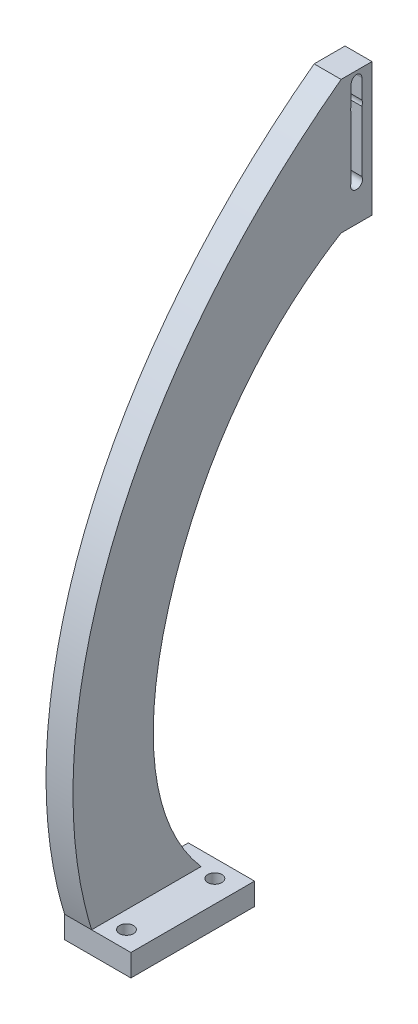
ISO-10303-21;
HEADER;
FILE_DESCRIPTION(('STEP AP214'),'2;1');
FILE_NAME('part.step','',(''),(''),'','','');
FILE_SCHEMA(('AUTOMOTIVE_DESIGN { 1 0 10303 214 1 1 1 1 }'));
ENDSEC;
DATA;
#1=APPLICATION_CONTEXT('core data for automotive mechanical design processes');
#2=APPLICATION_PROTOCOL_DEFINITION('international standard','automotive_design',2000,#1);
#3=PRODUCT_CONTEXT('',#1,'mechanical');
#4=PRODUCT('Part','Part','',(#3));
#5=PRODUCT_RELATED_PRODUCT_CATEGORY('part','',(#4));
#6=PRODUCT_DEFINITION_FORMATION('','',#4);
#7=PRODUCT_DEFINITION_CONTEXT('part definition',#1,'design');
#8=PRODUCT_DEFINITION('design','',#6,#7);
#9=PRODUCT_DEFINITION_SHAPE('','',#8);
#10=(LENGTH_UNIT() NAMED_UNIT(*) SI_UNIT(.MILLI.,.METRE.));
#11=(NAMED_UNIT(*) PLANE_ANGLE_UNIT() SI_UNIT($,.RADIAN.));
#12=(NAMED_UNIT(*) SI_UNIT($,.STERADIAN.) SOLID_ANGLE_UNIT());
#13=UNCERTAINTY_MEASURE_WITH_UNIT(LENGTH_MEASURE(1.E-05),#10,'distance_accuracy_value','');
#14=(GEOMETRIC_REPRESENTATION_CONTEXT(3) GLOBAL_UNCERTAINTY_ASSIGNED_CONTEXT((#13)) GLOBAL_UNIT_ASSIGNED_CONTEXT((#10,
#11,#12)) REPRESENTATION_CONTEXT('',''));
#15=CARTESIAN_POINT('',(0.,0.,0.));
#16=DIRECTION('',(0.,0.,1.));
#17=DIRECTION('',(1.,0.,0.));
#18=AXIS2_PLACEMENT_3D('',#15,#16,#17);
#19=CARTESIAN_POINT('',(42.,136.5,-45.9823957456189));
#20=DIRECTION('',(-1.,0.,0.));
#21=DIRECTION('',(0.,0.,-1.));
#22=AXIS2_PLACEMENT_3D('',#19,#20,#21);
#23=CYLINDRICAL_SURFACE('',#22,1.35);
#24=CARTESIAN_POINT('',(35.,136.5,-45.9823957456189));
#25=DIRECTION('',(1.,0.,0.));
#26=DIRECTION('',(0.,0.,-1.));
#27=AXIS2_PLACEMENT_3D('',#24,#25,#26);
#28=CIRCLE('',#27,1.35);
#29=CARTESIAN_POINT('',(35.,135.881534156157,-47.1823957456189));
#30=VERTEX_POINT('',#29);
#31=CARTESIAN_POINT('',(35.,137.118465843843,-47.1823957456189));
#32=VERTEX_POINT('',#31);
#33=EDGE_CURVE('E272',#30,#32,#28,.T.);
#34=ORIENTED_EDGE('',*,*,#33,.F.);
#35=DIRECTION('',(-1.,0.,0.));
#36=VECTOR('',#35,1.);
#37=CARTESIAN_POINT('',(42.,135.881534156157,-47.1823957456189));
#38=LINE('',#37,#36);
#39=CARTESIAN_POINT('',(41.0999999999906,135.881534156157,-47.1823957456189));
#40=VERTEX_POINT('',#39);
#41=EDGE_CURVE('E53',#30,#40,#38,.F.);
#42=ORIENTED_EDGE('',*,*,#41,.T.);
#43=CARTESIAN_POINT('',(41.0999999999905,136.5,-45.9823957456189));
#44=DIRECTION('',(-1.,0.,0.));
#45=DIRECTION('',(0.,-1.,0.));
#46=AXIS2_PLACEMENT_3D('',#43,#44,#45);
#47=CIRCLE('',#46,1.35);
#48=CARTESIAN_POINT('',(41.0999999999905,137.118465843843,-47.1823957456189));
#49=VERTEX_POINT('',#48);
#50=EDGE_CURVE('E285',#49,#40,#47,.T.);
#51=ORIENTED_EDGE('',*,*,#50,.F.);
#52=DIRECTION('',(-1.,0.,0.));
#53=VECTOR('',#52,1.);
#54=CARTESIAN_POINT('',(42.,137.118465843843,-47.1823957456189));
#55=LINE('',#54,#53);
#56=EDGE_CURVE('E575',#49,#32,#55,.T.);
#57=ORIENTED_EDGE('',*,*,#56,.T.);
#58=EDGE_LOOP('',(#34,#42,#51,#57));
#59=FACE_BOUND('',#58,.T.);
#60=ADVANCED_FACE('F44',(#59),#23,.F.);
#61=CARTESIAN_POINT('',(40.,5.,0.));
#62=DIRECTION('',(0.,1.,0.));
#63=DIRECTION('',(0.,0.,1.));
#64=AXIS2_PLACEMENT_3D('',#61,#62,#63);
#65=PLANE('',#64);
#66=DIRECTION('',(0.,0.,-1.));
#67=VECTOR('',#66,1.);
#68=CARTESIAN_POINT('',(35.,5.,-14.));
#69=LINE('',#68,#67);
#70=CARTESIAN_POINT('',(35.,5.,-11.6));
#71=VERTEX_POINT('',#70);
#72=CARTESIAN_POINT('',(35.,5.,-14.));
#73=VERTEX_POINT('',#72);
#74=EDGE_CURVE('E244',#71,#73,#69,.T.);
#75=ORIENTED_EDGE('',*,*,#74,.F.);
#76=CARTESIAN_POINT('',(35.,5.,-10.));
#77=DIRECTION('',(0.,-1.,0.));
#78=DIRECTION('',(0.,0.,-1.));
#79=AXIS2_PLACEMENT_3D('',#76,#77,#78);
#80=CIRCLE('',#79,1.6);
#81=CARTESIAN_POINT('',(36.3889104928617,5.,-10.794309538416));
#82=VERTEX_POINT('',#81);
#83=EDGE_CURVE('E525',#71,#82,#80,.T.);
#84=ORIENTED_EDGE('',*,*,#83,.T.);
#85=DIRECTION('',(-1.,0.,0.));
#86=VECTOR('',#85,1.);
#87=CARTESIAN_POINT('',(193.493648523778,5.,-10.794309538416));
#88=LINE('',#87,#86);
#89=CARTESIAN_POINT('',(41.0999999999994,5.,-10.794309538416));
#90=VERTEX_POINT('',#89);
#91=EDGE_CURVE('E361',#90,#82,#88,.T.);
#92=ORIENTED_EDGE('',*,*,#91,.F.);
#93=DIRECTION('',(0.,0.,-1.));
#94=VECTOR('',#93,1.);
#95=CARTESIAN_POINT('',(41.0999999999993,5.,13.9999999999994));
#96=LINE('',#95,#94);
#97=CARTESIAN_POINT('',(41.0999999999994,5.,14.));
#98=VERTEX_POINT('',#97);
#99=EDGE_CURVE('E336',#98,#90,#96,.T.);
#100=ORIENTED_EDGE('',*,*,#99,.F.);
#101=DIRECTION('',(-1.,0.,0.));
#102=VECTOR('',#101,1.);
#103=CARTESIAN_POINT('',(50.,5.,14.));
#104=LINE('',#103,#102);
#105=CARTESIAN_POINT('',(50.,5.,14.));
#106=VERTEX_POINT('',#105);
#107=EDGE_CURVE('E552',#106,#98,#104,.T.);
#108=ORIENTED_EDGE('',*,*,#107,.F.);
#109=DIRECTION('',(0.,0.,1.));
#110=VECTOR('',#109,1.);
#111=CARTESIAN_POINT('',(50.,5.,-14.));
#112=LINE('',#111,#110);
#113=CARTESIAN_POINT('',(50.,5.,-14.));
#114=VERTEX_POINT('',#113);
#115=EDGE_CURVE('E547',#114,#106,#112,.T.);
#116=ORIENTED_EDGE('',*,*,#115,.F.);
#117=DIRECTION('',(1.,0.,0.));
#118=VECTOR('',#117,1.);
#119=CARTESIAN_POINT('',(50.,5.,-14.));
#120=LINE('',#119,#118);
#121=EDGE_CURVE('E544',#73,#114,#120,.T.);
#122=ORIENTED_EDGE('',*,*,#121,.F.);
#123=EDGE_LOOP('',(#75,#84,#92,#100,#108,#116,#122));
#124=FACE_BOUND('',#123,.T.);
#125=CARTESIAN_POINT('',(45.,5.,-10.));
#126=DIRECTION('',(0.,-1.,0.));
#127=DIRECTION('',(0.,0.,1.));
#128=AXIS2_PLACEMENT_3D('',#125,#126,#127);
#129=CIRCLE('',#128,1.6);
#130=CARTESIAN_POINT('',(45.,5.,-8.4));
#131=VERTEX_POINT('',#130);
#132=EDGE_CURVE('E535',#131,#131,#129,.T.);
#133=ORIENTED_EDGE('',*,*,#132,.T.);
#134=EDGE_LOOP('',(#133));
#135=FACE_BOUND('',#134,.T.);
#136=CARTESIAN_POINT('',(45.,5.,9.99999999999998));
#137=DIRECTION('',(0.,-1.,0.));
#138=DIRECTION('',(0.,0.,-1.));
#139=AXIS2_PLACEMENT_3D('',#136,#137,#138);
#140=CIRCLE('',#139,1.6);
#141=CARTESIAN_POINT('',(45.,5.,8.39999999999998));
#142=VERTEX_POINT('',#141);
#143=EDGE_CURVE('E586',#142,#142,#140,.T.);
#144=ORIENTED_EDGE('',*,*,#143,.T.);
#145=EDGE_LOOP('',(#144));
#146=FACE_BOUND('',#145,.T.);
#147=ADVANCED_FACE('F425',(#124,#135,#146),#65,.T.);
#148=CARTESIAN_POINT('',(40.,0.,0.));
#149=DIRECTION('',(0.,1.,0.));
#150=DIRECTION('',(0.,0.,1.));
#151=AXIS2_PLACEMENT_3D('',#148,#149,#150);
#152=PLANE('',#151);
#153=CARTESIAN_POINT('',(45.,0.,-10.));
#154=DIRECTION('',(0.,-1.,0.));
#155=DIRECTION('',(0.,0.,1.));
#156=AXIS2_PLACEMENT_3D('',#153,#154,#155);
#157=CIRCLE('',#156,1.6);
#158=CARTESIAN_POINT('',(45.,0.,-8.4));
#159=VERTEX_POINT('',#158);
#160=EDGE_CURVE('E540',#159,#159,#157,.T.);
#161=ORIENTED_EDGE('',*,*,#160,.F.);
#162=EDGE_LOOP('',(#161));
#163=FACE_BOUND('',#162,.T.);
#164=DIRECTION('',(-1.,0.,0.));
#165=VECTOR('',#164,1.);
#166=CARTESIAN_POINT('',(50.,0.,14.));
#167=LINE('',#166,#165);
#168=CARTESIAN_POINT('',(50.,0.,14.));
#169=VERTEX_POINT('',#168);
#170=CARTESIAN_POINT('',(35.,0.,14.));
#171=VERTEX_POINT('',#170);
#172=EDGE_CURVE('E548',#169,#171,#167,.T.);
#173=ORIENTED_EDGE('',*,*,#172,.T.);
#174=DIRECTION('',(0.,0.,-1.));
#175=VECTOR('',#174,1.);
#176=CARTESIAN_POINT('',(35.,0.,0.));
#177=LINE('',#176,#175);
#178=CARTESIAN_POINT('',(35.,0.,11.6));
#179=VERTEX_POINT('',#178);
#180=EDGE_CURVE('E263',#171,#179,#177,.T.);
#181=ORIENTED_EDGE('',*,*,#180,.T.);
#182=CARTESIAN_POINT('',(35.,0.,9.99999999999998));
#183=DIRECTION('',(0.,-1.,0.));
#184=DIRECTION('',(0.,0.,1.));
#185=AXIS2_PLACEMENT_3D('',#182,#183,#184);
#186=CIRCLE('',#185,1.6);
#187=CARTESIAN_POINT('',(35.,0.,8.39999999999998));
#188=VERTEX_POINT('',#187);
#189=EDGE_CURVE('E521',#188,#179,#186,.T.);
#190=ORIENTED_EDGE('',*,*,#189,.F.);
#191=CARTESIAN_POINT('',(35.,0.,-8.4));
#192=VERTEX_POINT('',#191);
#193=EDGE_CURVE('E257',#188,#192,#177,.T.);
#194=ORIENTED_EDGE('',*,*,#193,.T.);
#195=CARTESIAN_POINT('',(35.,0.,-10.));
#196=DIRECTION('',(0.,-1.,0.));
#197=DIRECTION('',(0.,0.,-1.));
#198=AXIS2_PLACEMENT_3D('',#195,#196,#197);
#199=CIRCLE('',#198,1.6);
#200=CARTESIAN_POINT('',(35.,0.,-11.6));
#201=VERTEX_POINT('',#200);
#202=EDGE_CURVE('E519',#201,#192,#199,.T.);
#203=ORIENTED_EDGE('',*,*,#202,.F.);
#204=CARTESIAN_POINT('',(35.,0.,-14.));
#205=VERTEX_POINT('',#204);
#206=EDGE_CURVE('E262',#201,#205,#177,.T.);
#207=ORIENTED_EDGE('',*,*,#206,.T.);
#208=DIRECTION('',(1.,0.,0.));
#209=VECTOR('',#208,1.);
#210=CARTESIAN_POINT('',(50.,0.,-14.));
#211=LINE('',#210,#209);
#212=CARTESIAN_POINT('',(50.,0.,-14.));
#213=VERTEX_POINT('',#212);
#214=EDGE_CURVE('E539',#205,#213,#211,.T.);
#215=ORIENTED_EDGE('',*,*,#214,.T.);
#216=DIRECTION('',(0.,0.,1.));
#217=VECTOR('',#216,1.);
#218=CARTESIAN_POINT('',(50.,0.,-14.));
#219=LINE('',#218,#217);
#220=EDGE_CURVE('E559',#213,#169,#219,.T.);
#221=ORIENTED_EDGE('',*,*,#220,.T.);
#222=EDGE_LOOP('',(#173,#181,#190,#194,#203,#207,#215,#221));
#223=FACE_BOUND('',#222,.T.);
#224=CARTESIAN_POINT('',(45.,0.,9.99999999999998));
#225=DIRECTION('',(0.,-1.,0.));
#226=DIRECTION('',(0.,0.,-1.));
#227=AXIS2_PLACEMENT_3D('',#224,#225,#226);
#228=CIRCLE('',#227,1.6);
#229=CARTESIAN_POINT('',(45.,0.,8.39999999999998));
#230=VERTEX_POINT('',#229);
#231=EDGE_CURVE('E377',#230,#230,#228,.T.);
#232=ORIENTED_EDGE('',*,*,#231,.F.);
#233=EDGE_LOOP('',(#232));
#234=FACE_BOUND('',#233,.T.);
#235=ADVANCED_FACE('F428',(#163,#223,#234),#152,.F.);
#236=CARTESIAN_POINT('',(50.,5.,-14.));
#237=DIRECTION('',(0.,0.,1.));
#238=DIRECTION('',(-1.,0.,0.));
#239=AXIS2_PLACEMENT_3D('',#236,#237,#238);
#240=PLANE('',#239);
#241=ORIENTED_EDGE('',*,*,#214,.F.);
#242=DIRECTION('',(0.,1.,0.));
#243=VECTOR('',#242,1.);
#244=CARTESIAN_POINT('',(35.,-5.,-14.));
#245=LINE('',#244,#243);
#246=EDGE_CURVE('E248',#205,#73,#245,.T.);
#247=ORIENTED_EDGE('',*,*,#246,.T.);
#248=ORIENTED_EDGE('',*,*,#121,.T.);
#249=DIRECTION('',(0.,-1.,0.));
#250=VECTOR('',#249,1.);
#251=CARTESIAN_POINT('',(50.,5.,-14.));
#252=LINE('',#251,#250);
#253=EDGE_CURVE('E567',#114,#213,#252,.T.);
#254=ORIENTED_EDGE('',*,*,#253,.T.);
#255=EDGE_LOOP('',(#241,#247,#248,#254));
#256=FACE_BOUND('',#255,.T.);
#257=ADVANCED_FACE('F46',(#256),#240,.F.);
#258=CARTESIAN_POINT('',(50.,5.,-14.));
#259=DIRECTION('',(-1.,0.,0.));
#260=DIRECTION('',(0.,0.,-1.));
#261=AXIS2_PLACEMENT_3D('',#258,#259,#260);
#262=PLANE('',#261);
#263=ORIENTED_EDGE('',*,*,#220,.F.);
#264=ORIENTED_EDGE('',*,*,#253,.F.);
#265=ORIENTED_EDGE('',*,*,#115,.T.);
#266=DIRECTION('',(0.,-1.,0.));
#267=VECTOR('',#266,1.);
#268=CARTESIAN_POINT('',(50.,5.,14.));
#269=LINE('',#268,#267);
#270=EDGE_CURVE('E556',#106,#169,#269,.T.);
#271=ORIENTED_EDGE('',*,*,#270,.T.);
#272=EDGE_LOOP('',(#263,#264,#265,#271));
#273=FACE_BOUND('',#272,.T.);
#274=ADVANCED_FACE('F434',(#273),#262,.F.);
#275=CARTESIAN_POINT('',(50.,5.,14.));
#276=DIRECTION('',(0.,0.,-1.));
#277=DIRECTION('',(1.,0.,0.));
#278=AXIS2_PLACEMENT_3D('',#275,#276,#277);
#279=PLANE('',#278);
#280=DIRECTION('',(-1.,0.,0.));
#281=VECTOR('',#280,1.);
#282=CARTESIAN_POINT('',(193.493648523778,5.,14.));
#283=LINE('',#282,#281);
#284=CARTESIAN_POINT('',(35.,5.,14.));
#285=VERTEX_POINT('',#284);
#286=EDGE_CURVE('E349',#98,#285,#283,.T.);
#287=ORIENTED_EDGE('',*,*,#286,.T.);
#288=DIRECTION('',(0.,1.,0.));
#289=VECTOR('',#288,1.);
#290=CARTESIAN_POINT('',(35.,-5.,14.));
#291=LINE('',#290,#289);
#292=EDGE_CURVE('E247',#171,#285,#291,.T.);
#293=ORIENTED_EDGE('',*,*,#292,.F.);
#294=ORIENTED_EDGE('',*,*,#172,.F.);
#295=ORIENTED_EDGE('',*,*,#270,.F.);
#296=ORIENTED_EDGE('',*,*,#107,.T.);
#297=EDGE_LOOP('',(#287,#293,#294,#295,#296));
#298=FACE_BOUND('',#297,.T.);
#299=ADVANCED_FACE('F423',(#298),#279,.F.);
#300=CARTESIAN_POINT('',(45.,5.,-10.));
#301=DIRECTION('',(0.,-1.,0.));
#302=DIRECTION('',(0.,0.,-1.));
#303=AXIS2_PLACEMENT_3D('',#300,#301,#302);
#304=CYLINDRICAL_SURFACE('',#303,1.6);
#305=ORIENTED_EDGE('',*,*,#132,.F.);
#306=EDGE_LOOP('',(#305));
#307=FACE_BOUND('',#306,.T.);
#308=ORIENTED_EDGE('',*,*,#160,.T.);
#309=EDGE_LOOP('',(#308));
#310=FACE_BOUND('',#309,.T.);
#311=ADVANCED_FACE('F419',(#307,#310),#304,.F.);
#312=CARTESIAN_POINT('',(35.,5.,-10.));
#313=DIRECTION('',(0.,-1.,0.));
#314=DIRECTION('',(0.,0.,-1.));
#315=AXIS2_PLACEMENT_3D('',#312,#313,#314);
#316=CYLINDRICAL_SURFACE('',#315,1.6);
#317=DIRECTION('',(0.,-1.,0.));
#318=VECTOR('',#317,1.);
#319=CARTESIAN_POINT('',(35.,5.,-8.4));
#320=LINE('',#319,#318);
#321=CARTESIAN_POINT('',(35.,5.,-8.4));
#322=VERTEX_POINT('',#321);
#323=EDGE_CURVE('E261',#322,#192,#320,.T.);
#324=ORIENTED_EDGE('',*,*,#323,.F.);
#325=EDGE_CURVE('E511',#82,#322,#80,.T.);
#326=ORIENTED_EDGE('',*,*,#325,.F.);
#327=ORIENTED_EDGE('',*,*,#83,.F.);
#328=DIRECTION('',(0.,-1.,0.));
#329=VECTOR('',#328,1.);
#330=CARTESIAN_POINT('',(35.,5.,-11.6));
#331=LINE('',#330,#329);
#332=EDGE_CURVE('E269',#201,#71,#331,.F.);
#333=ORIENTED_EDGE('',*,*,#332,.F.);
#334=ORIENTED_EDGE('',*,*,#202,.T.);
#335=EDGE_LOOP('',(#324,#326,#327,#333,#334));
#336=FACE_BOUND('',#335,.T.);
#337=ADVANCED_FACE('F415',(#336),#316,.F.);
#338=CARTESIAN_POINT('',(35.,5.,9.99999999999998));
#339=DIRECTION('',(0.,-1.,0.));
#340=DIRECTION('',(0.,0.,-1.));
#341=AXIS2_PLACEMENT_3D('',#338,#339,#340);
#342=CYLINDRICAL_SURFACE('',#341,1.6);
#343=DIRECTION('',(0.,-1.,0.));
#344=VECTOR('',#343,1.);
#345=CARTESIAN_POINT('',(35.,5.,11.6));
#346=LINE('',#345,#344);
#347=CARTESIAN_POINT('',(35.,5.,11.6));
#348=VERTEX_POINT('',#347);
#349=EDGE_CURVE('E266',#348,#179,#346,.T.);
#350=ORIENTED_EDGE('',*,*,#349,.F.);
#351=CARTESIAN_POINT('',(35.,5.,9.99999999999998));
#352=DIRECTION('',(0.,-1.,0.));
#353=DIRECTION('',(0.,0.,1.));
#354=AXIS2_PLACEMENT_3D('',#351,#352,#353);
#355=CIRCLE('',#354,1.6);
#356=CARTESIAN_POINT('',(35.,5.,8.39999999999998));
#357=VERTEX_POINT('',#356);
#358=EDGE_CURVE('E526',#357,#348,#355,.T.);
#359=ORIENTED_EDGE('',*,*,#358,.F.);
#360=DIRECTION('',(0.,-1.,0.));
#361=VECTOR('',#360,1.);
#362=CARTESIAN_POINT('',(35.,5.,8.39999999999998));
#363=LINE('',#362,#361);
#364=EDGE_CURVE('E252',#188,#357,#363,.F.);
#365=ORIENTED_EDGE('',*,*,#364,.F.);
#366=ORIENTED_EDGE('',*,*,#189,.T.);
#367=EDGE_LOOP('',(#350,#359,#365,#366));
#368=FACE_BOUND('',#367,.T.);
#369=ADVANCED_FACE('F411',(#368),#342,.F.);
#370=CARTESIAN_POINT('',(45.,5.,9.99999999999998));
#371=DIRECTION('',(0.,-1.,0.));
#372=DIRECTION('',(0.,0.,-1.));
#373=AXIS2_PLACEMENT_3D('',#370,#371,#372);
#374=CYLINDRICAL_SURFACE('',#373,1.6);
#375=ORIENTED_EDGE('',*,*,#143,.F.);
#376=EDGE_LOOP('',(#375));
#377=FACE_BOUND('',#376,.T.);
#378=ORIENTED_EDGE('',*,*,#231,.T.);
#379=EDGE_LOOP('',(#378));
#380=FACE_BOUND('',#379,.T.);
#381=ADVANCED_FACE('F405',(#377,#380),#374,.F.);
#382=CARTESIAN_POINT('',(193.493648523778,5.,14.));
#383=DIRECTION('',(0.,-1.,0.));
#384=DIRECTION('',(0.,0.,-1.));
#385=AXIS2_PLACEMENT_3D('',#382,#383,#384);
#386=PLANE('',#385);
#387=ORIENTED_EDGE('',*,*,#358,.T.);
#388=DIRECTION('',(0.,0.,-1.));
#389=VECTOR('',#388,1.);
#390=CARTESIAN_POINT('',(35.,5.,14.));
#391=LINE('',#390,#389);
#392=EDGE_CURVE('E329',#348,#357,#391,.T.);
#393=ORIENTED_EDGE('',*,*,#392,.T.);
#394=EDGE_LOOP('',(#387,#393));
#395=FACE_BOUND('',#394,.T.);
#396=ADVANCED_FACE('F401',(#395),#386,.T.);
#397=ORIENTED_EDGE('',*,*,#325,.T.);
#398=CARTESIAN_POINT('',(35.,5.,-10.794309538416));
#399=VERTEX_POINT('',#398);
#400=EDGE_CURVE('E322',#322,#399,#391,.T.);
#401=ORIENTED_EDGE('',*,*,#400,.T.);
#402=EDGE_CURVE('E343',#82,#399,#88,.T.);
#403=ORIENTED_EDGE('',*,*,#402,.F.);
#404=EDGE_LOOP('',(#397,#401,#403));
#405=FACE_BOUND('',#404,.T.);
#406=ADVANCED_FACE('F404',(#405),#386,.T.);
#407=CARTESIAN_POINT('',(41.1000000000003,-6.49999999999346,-42.4823957456185));
#408=DIRECTION('',(1.,0.,0.));
#409=DIRECTION('',(0.,0.,-1.));
#410=AXIS2_PLACEMENT_3D('',#407,#408,#409);
#411=PLANE('',#410);
#412=DIRECTION('',(0.,1.,0.));
#413=VECTOR('',#412,1.);
#414=CARTESIAN_POINT('',(41.0999999999902,141.5,-47.1823957456189));
#415=LINE('',#414,#413);
#416=CARTESIAN_POINT('',(41.0999999999915,122.118465843843,-47.1823957456189));
#417=VERTEX_POINT('',#416);
#418=EDGE_CURVE('E68',#417,#40,#415,.T.);
#419=ORIENTED_EDGE('',*,*,#418,.F.);
#420=CARTESIAN_POINT('',(41.0999999999915,121.5,-45.9823957456189));
#421=DIRECTION('',(-1.,0.,0.));
#422=DIRECTION('',(0.,-1.,0.));
#423=AXIS2_PLACEMENT_3D('',#420,#421,#422);
#424=CIRCLE('',#423,1.35);
#425=CARTESIAN_POINT('',(41.0999999999915,122.118465843843,-44.7823957456189));
#426=VERTEX_POINT('',#425);
#427=EDGE_CURVE('E281',#417,#426,#424,.T.);
#428=ORIENTED_EDGE('',*,*,#427,.T.);
#429=DIRECTION('',(0.,-1.,0.));
#430=VECTOR('',#429,1.);
#431=CARTESIAN_POINT('',(41.0999999999902,141.5,-44.7823957456189));
#432=LINE('',#431,#430);
#433=CARTESIAN_POINT('',(41.0999999999905,135.881534156157,-44.7823957456189));
#434=VERTEX_POINT('',#433);
#435=EDGE_CURVE('E213',#434,#426,#432,.T.);
#436=ORIENTED_EDGE('',*,*,#435,.F.);
#437=CARTESIAN_POINT('',(41.0999999999905,137.118465843843,-44.7823957456189));
#438=VERTEX_POINT('',#437);
#439=EDGE_CURVE('E220',#434,#438,#47,.T.);
#440=ORIENTED_EDGE('',*,*,#439,.T.);
#441=CARTESIAN_POINT('',(41.0999999999902,141.5,-44.7823957456189));
#442=VERTEX_POINT('',#441);
#443=EDGE_CURVE('E196',#442,#438,#432,.T.);
#444=ORIENTED_EDGE('',*,*,#443,.F.);
#445=CARTESIAN_POINT('',(41.0999999999902,141.5,-45.9823957456189));
#446=DIRECTION('',(1.,0.,0.));
#447=DIRECTION('',(0.,1.,0.));
#448=AXIS2_PLACEMENT_3D('',#445,#446,#447);
#449=CIRCLE('',#448,1.2);
#450=CARTESIAN_POINT('',(41.0999999999902,141.5,-47.1823957456189));
#451=VERTEX_POINT('',#450);
#452=EDGE_CURVE('E206',#451,#442,#449,.T.);
#453=ORIENTED_EDGE('',*,*,#452,.F.);
#454=EDGE_CURVE('E222',#49,#451,#415,.T.);
#455=ORIENTED_EDGE('',*,*,#454,.F.);
#456=ORIENTED_EDGE('',*,*,#50,.T.);
#457=EDGE_LOOP('',(#419,#428,#436,#440,#444,#453,#455,#456));
#458=FACE_BOUND('',#457,.T.);
#459=CARTESIAN_POINT('',(41.1000000000003,143.5,-42.4823957456188));
#460=CARTESIAN_POINT('',(41.1000000000003,126.307389699459,-19.3189401750505));
#461=CARTESIAN_POINT('',(41.1000000000003,83.5996229215115,16.0596028367935));
#462=CARTESIAN_POINT('',(41.1000000000003,28.0723834358633,21.0909800526701));
#463=CARTESIAN_POINT('',(41.1000000000003,5.,14.));
#464=B_SPLINE_CURVE_WITH_KNOTS('',3,(#459,#460,#461,#462,#463),.UNSPECIFIED.,.F.,.F.,(4,1,4),
(0.,0.547613245506543,1.),.UNSPECIFIED.);
#465=CARTESIAN_POINT('',(41.09999999999,143.5,-42.4823957456189));
#466=VERTEX_POINT('',#465);
#467=EDGE_CURVE('E344',#466,#98,#464,.T.);
#468=ORIENTED_EDGE('',*,*,#467,.T.);
#469=ORIENTED_EDGE('',*,*,#99,.T.);
#470=CARTESIAN_POINT('',(41.1000000000003,5.,-10.794309538416));
#471=CARTESIAN_POINT('',(41.1000000000003,21.7001632070096,3.62550837576873));
#472=CARTESIAN_POINT('',(41.1000000000003,68.5304940388407,0.0388749019147541));
#473=CARTESIAN_POINT('',(41.1000000000003,102.563540471866,-24.7866435793691));
#474=CARTESIAN_POINT('',(41.1000000000003,113.374773087632,-42.4823957456189));
#475=B_SPLINE_CURVE_WITH_KNOTS('',3,(#470,#471,#472,#473,#474),.UNSPECIFIED.,.F.,.F.,(4,1,4),
(0.,0.510479211791621,1.),.UNSPECIFIED.);
#476=CARTESIAN_POINT('',(41.1000000000003,113.374773087632,-42.4823957456189));
#477=VERTEX_POINT('',#476);
#478=EDGE_CURVE('E351',#90,#477,#475,.T.);
#479=ORIENTED_EDGE('',*,*,#478,.T.);
#480=DIRECTION('',(0.,0.,1.));
#481=VECTOR('',#480,1.);
#482=CARTESIAN_POINT('',(41.1000000000003,113.374773087632,-49.4823957456189));
#483=LINE('',#482,#481);
#484=CARTESIAN_POINT('',(41.1000000000003,113.374773087632,-49.4823957456189));
#485=VERTEX_POINT('',#484);
#486=EDGE_CURVE('E309',#485,#477,#483,.T.);
#487=ORIENTED_EDGE('',*,*,#486,.F.);
#488=DIRECTION('',(-3.41817128327447E-13,1.,0.));
#489=VECTOR('',#488,1.);
#490=CARTESIAN_POINT('',(41.1000000000003,113.374773087632,-49.4823957456189));
#491=LINE('',#490,#489);
#492=CARTESIAN_POINT('',(41.09999999999,143.5,-49.4823957456189));
#493=VERTEX_POINT('',#492);
#494=EDGE_CURVE('E295',#485,#493,#491,.T.);
#495=ORIENTED_EDGE('',*,*,#494,.T.);
#496=DIRECTION('',(0.,0.,1.));
#497=VECTOR('',#496,1.);
#498=CARTESIAN_POINT('',(41.09999999999,143.5,-49.4823957456189));
#499=LINE('',#498,#497);
#500=EDGE_CURVE('E305',#493,#466,#499,.T.);
#501=ORIENTED_EDGE('',*,*,#500,.T.);
#502=EDGE_LOOP('',(#468,#469,#479,#487,#495,#501));
#503=FACE_BOUND('',#502,.T.);
#504=ADVANCED_FACE('F216',(#458,#503),#411,.T.);
#505=CARTESIAN_POINT('',(193.493648523778,5.,-10.794309538416));
#506=CARTESIAN_POINT('',(193.493648523778,21.7001632070096,3.62550837576871));
#507=CARTESIAN_POINT('',(193.493648523778,68.5304940388407,0.0388749019147352));
#508=CARTESIAN_POINT('',(193.493648523778,102.563540471866,-24.7866435793692));
#509=CARTESIAN_POINT('',(193.493648523778,113.374773087632,-42.4823957456189));
#510=B_SPLINE_CURVE_WITH_KNOTS('',3,(#505,#506,#507,#508,#509),.UNSPECIFIED.,.F.,.F.,(4,1,4),
(0.,0.510479211791621,1.),.UNSPECIFIED.);
#511=DIRECTION('',(-1.,0.,0.));
#512=VECTOR('',#511,1.);
#513=SURFACE_OF_LINEAR_EXTRUSION('',#510,#512);
#514=ORIENTED_EDGE('',*,*,#91,.T.);
#515=ORIENTED_EDGE('',*,*,#402,.T.);
#516=CARTESIAN_POINT('',(35.,5.,-10.794309538416));
#517=CARTESIAN_POINT('',(35.,21.7001632070096,3.62550837576873));
#518=CARTESIAN_POINT('',(35.,68.5304940388407,0.0388749019147549));
#519=CARTESIAN_POINT('',(35.,102.563540471866,-24.7866435793691));
#520=CARTESIAN_POINT('',(35.,113.374773087632,-42.4823957456189));
#521=B_SPLINE_CURVE_WITH_KNOTS('',3,(#516,#517,#518,#519,#520),.UNSPECIFIED.,.F.,.F.,(4,1,4),
(0.,0.510479211791621,1.),.UNSPECIFIED.);
#522=CARTESIAN_POINT('',(35.,113.374773087632,-42.4823957456189));
#523=VERTEX_POINT('',#522);
#524=EDGE_CURVE('E330',#399,#523,#521,.T.);
#525=ORIENTED_EDGE('',*,*,#524,.T.);
#526=DIRECTION('',(-1.,0.,0.));
#527=VECTOR('',#526,1.);
#528=CARTESIAN_POINT('',(193.493648523778,113.374773087632,-42.4823957456189));
#529=LINE('',#528,#527);
#530=EDGE_CURVE('E360',#477,#523,#529,.T.);
#531=ORIENTED_EDGE('',*,*,#530,.F.);
#532=ORIENTED_EDGE('',*,*,#478,.F.);
#533=EDGE_LOOP('',(#514,#515,#525,#531,#532));
#534=FACE_BOUND('',#533,.T.);
#535=ADVANCED_FACE('F395',(#534),#513,.F.);
#536=CARTESIAN_POINT('',(193.493648523778,143.5,-42.4823957456189));
#537=CARTESIAN_POINT('',(193.493648523778,126.307389699459,-19.3189401750505));
#538=CARTESIAN_POINT('',(193.493648523778,83.5996229215115,16.0596028367935));
#539=CARTESIAN_POINT('',(193.493648523778,28.0723834358633,21.0909800526701));
#540=CARTESIAN_POINT('',(193.493648523778,5.,14.));
#541=B_SPLINE_CURVE_WITH_KNOTS('',3,(#536,#537,#538,#539,#540),.UNSPECIFIED.,.F.,.F.,(4,1,4),
(0.,0.547613245506543,1.),.UNSPECIFIED.);
#542=DIRECTION('',(-1.,0.,0.));
#543=VECTOR('',#542,1.);
#544=SURFACE_OF_LINEAR_EXTRUSION('',#541,#543);
#545=DIRECTION('',(-1.,0.,0.));
#546=VECTOR('',#545,1.);
#547=CARTESIAN_POINT('',(193.493648523778,143.5,-42.4823957456189));
#548=LINE('',#547,#546);
#549=CARTESIAN_POINT('',(35.,143.5,-42.4823957456189));
#550=VERTEX_POINT('',#549);
#551=EDGE_CURVE('E350',#466,#550,#548,.T.);
#552=ORIENTED_EDGE('',*,*,#551,.T.);
#553=CARTESIAN_POINT('',(35.,143.5,-42.4823957456188));
#554=CARTESIAN_POINT('',(35.,126.307389699459,-19.3189401750505));
#555=CARTESIAN_POINT('',(35.,83.5996229215115,16.0596028367935));
#556=CARTESIAN_POINT('',(35.,28.0723834358633,21.0909800526701));
#557=CARTESIAN_POINT('',(35.,5.,14.));
#558=B_SPLINE_CURVE_WITH_KNOTS('',3,(#553,#554,#555,#556,#557),.UNSPECIFIED.,.F.,.F.,(4,1,4),
(0.,0.547613245506543,1.),.UNSPECIFIED.);
#559=EDGE_CURVE('E316',#550,#285,#558,.T.);
#560=ORIENTED_EDGE('',*,*,#559,.T.);
#561=ORIENTED_EDGE('',*,*,#286,.F.);
#562=ORIENTED_EDGE('',*,*,#467,.F.);
#563=EDGE_LOOP('',(#552,#560,#561,#562));
#564=FACE_BOUND('',#563,.T.);
#565=ADVANCED_FACE('F390',(#564),#544,.F.);
#566=CARTESIAN_POINT('',(35.,82.7027915395324,7.44548077944377));
#567=DIRECTION('',(-1.,0.,0.));
#568=DIRECTION('',(0.,0.,-1.));
#569=AXIS2_PLACEMENT_3D('',#566,#567,#568);
#570=PLANE('',#569);
#571=DIRECTION('',(0.,-1.,0.));
#572=VECTOR('',#571,1.);
#573=CARTESIAN_POINT('',(35.,82.7027915395325,-47.1823957456189));
#574=LINE('',#573,#572);
#575=CARTESIAN_POINT('',(35.,122.118465843843,-47.1823957456189));
#576=VERTEX_POINT('',#575);
#577=EDGE_CURVE('E239',#30,#576,#574,.T.);
#578=ORIENTED_EDGE('',*,*,#577,.F.);
#579=ORIENTED_EDGE('',*,*,#33,.T.);
#580=CARTESIAN_POINT('',(35.,141.5,-47.1823957456189));
#581=VERTEX_POINT('',#580);
#582=EDGE_CURVE('E236',#581,#32,#574,.T.);
#583=ORIENTED_EDGE('',*,*,#582,.F.);
#584=CARTESIAN_POINT('',(35.,141.5,-45.9823957456189));
#585=DIRECTION('',(-1.,0.,0.));
#586=DIRECTION('',(0.,0.,1.));
#587=AXIS2_PLACEMENT_3D('',#584,#585,#586);
#588=CIRCLE('',#587,1.2);
#589=CARTESIAN_POINT('',(35.,141.5,-44.7823957456189));
#590=VERTEX_POINT('',#589);
#591=EDGE_CURVE('E11',#590,#581,#588,.T.);
#592=ORIENTED_EDGE('',*,*,#591,.F.);
#593=DIRECTION('',(0.,1.,0.));
#594=VECTOR('',#593,1.);
#595=CARTESIAN_POINT('',(35.,82.7027915395324,-44.7823957456189));
#596=LINE('',#595,#594);
#597=CARTESIAN_POINT('',(35.,137.118465843843,-44.7823957456189));
#598=VERTEX_POINT('',#597);
#599=EDGE_CURVE('E199',#598,#590,#596,.T.);
#600=ORIENTED_EDGE('',*,*,#599,.F.);
#601=CARTESIAN_POINT('',(35.,135.881534156157,-44.7823957456189));
#602=VERTEX_POINT('',#601);
#603=EDGE_CURVE('E276',#598,#602,#28,.T.);
#604=ORIENTED_EDGE('',*,*,#603,.T.);
#605=CARTESIAN_POINT('',(35.,122.118465843843,-44.7823957456189));
#606=VERTEX_POINT('',#605);
#607=EDGE_CURVE('E60',#606,#602,#596,.T.);
#608=ORIENTED_EDGE('',*,*,#607,.F.);
#609=CARTESIAN_POINT('',(35.,121.5,-45.9823957456189));
#610=DIRECTION('',(1.,0.,0.));
#611=DIRECTION('',(0.,0.,-1.));
#612=AXIS2_PLACEMENT_3D('',#609,#610,#611);
#613=CIRCLE('',#612,1.35);
#614=EDGE_CURVE('E277',#606,#576,#613,.T.);
#615=ORIENTED_EDGE('',*,*,#614,.T.);
#616=EDGE_LOOP('',(#578,#579,#583,#592,#600,#604,#608,#615));
#617=FACE_BOUND('',#616,.T.);
#618=ORIENTED_EDGE('',*,*,#559,.F.);
#619=DIRECTION('',(0.,0.,1.));
#620=VECTOR('',#619,1.);
#621=CARTESIAN_POINT('',(35.,143.5,-49.4823957456189));
#622=LINE('',#621,#620);
#623=CARTESIAN_POINT('',(35.,143.5,-49.4823957456189));
#624=VERTEX_POINT('',#623);
#625=EDGE_CURVE('E302',#624,#550,#622,.T.);
#626=ORIENTED_EDGE('',*,*,#625,.F.);
#627=DIRECTION('',(0.,-1.,0.));
#628=VECTOR('',#627,1.);
#629=CARTESIAN_POINT('',(35.,143.5,-49.4823957456189));
#630=LINE('',#629,#628);
#631=CARTESIAN_POINT('',(35.,113.374773087632,-49.4823957456189));
#632=VERTEX_POINT('',#631);
#633=EDGE_CURVE('E288',#624,#632,#630,.T.);
#634=ORIENTED_EDGE('',*,*,#633,.T.);
#635=DIRECTION('',(0.,0.,1.));
#636=VECTOR('',#635,1.);
#637=CARTESIAN_POINT('',(35.,113.374773087632,-49.4823957456189));
#638=LINE('',#637,#636);
#639=EDGE_CURVE('E313',#632,#523,#638,.T.);
#640=ORIENTED_EDGE('',*,*,#639,.T.);
#641=ORIENTED_EDGE('',*,*,#524,.F.);
#642=ORIENTED_EDGE('',*,*,#400,.F.);
#643=ORIENTED_EDGE('',*,*,#323,.T.);
#644=ORIENTED_EDGE('',*,*,#193,.F.);
#645=ORIENTED_EDGE('',*,*,#364,.T.);
#646=ORIENTED_EDGE('',*,*,#392,.F.);
#647=ORIENTED_EDGE('',*,*,#349,.T.);
#648=ORIENTED_EDGE('',*,*,#180,.F.);
#649=ORIENTED_EDGE('',*,*,#292,.T.);
#650=EDGE_LOOP('',(#618,#626,#634,#640,#641,#642,#643,#644,#645,#646,#647,#648,#649));
#651=FACE_BOUND('',#650,.T.);
#652=ADVANCED_FACE('F394',(#617,#651),#570,.T.);
#653=CARTESIAN_POINT('',(35.,113.374773087632,-49.4823957456189));
#654=DIRECTION('',(0.,1.,0.));
#655=DIRECTION('',(0.,0.,1.));
#656=AXIS2_PLACEMENT_3D('',#653,#654,#655);
#657=PLANE('',#656);
#658=ORIENTED_EDGE('',*,*,#530,.T.);
#659=ORIENTED_EDGE('',*,*,#639,.F.);
#660=DIRECTION('',(1.,0.,0.));
#661=VECTOR('',#660,1.);
#662=CARTESIAN_POINT('',(35.,113.374773087632,-49.4823957456189));
#663=LINE('',#662,#661);
#664=EDGE_CURVE('E292',#632,#485,#663,.T.);
#665=ORIENTED_EDGE('',*,*,#664,.T.);
#666=ORIENTED_EDGE('',*,*,#486,.T.);
#667=EDGE_LOOP('',(#658,#659,#665,#666));
#668=FACE_BOUND('',#667,.T.);
#669=ADVANCED_FACE('F488',(#668),#657,.F.);
#670=CARTESIAN_POINT('',(41.09999999999,143.5,-49.4823957456189));
#671=DIRECTION('',(0.,-1.,0.));
#672=DIRECTION('',(0.,0.,-1.));
#673=AXIS2_PLACEMENT_3D('',#670,#671,#672);
#674=PLANE('',#673);
#675=ORIENTED_EDGE('',*,*,#551,.F.);
#676=ORIENTED_EDGE('',*,*,#500,.F.);
#677=DIRECTION('',(-1.,0.,0.));
#678=VECTOR('',#677,1.);
#679=CARTESIAN_POINT('',(41.09999999999,143.5,-49.4823957456189));
#680=LINE('',#679,#678);
#681=EDGE_CURVE('E299',#493,#624,#680,.T.);
#682=ORIENTED_EDGE('',*,*,#681,.T.);
#683=ORIENTED_EDGE('',*,*,#625,.T.);
#684=EDGE_LOOP('',(#675,#676,#682,#683));
#685=FACE_BOUND('',#684,.T.);
#686=ADVANCED_FACE('F496',(#685),#674,.F.);
#687=CARTESIAN_POINT('',(40.,0.,-49.4823957456189));
#688=DIRECTION('',(0.,0.,-1.));
#689=DIRECTION('',(0.,1.,0.));
#690=AXIS2_PLACEMENT_3D('',#687,#688,#689);
#691=PLANE('',#690);
#692=ORIENTED_EDGE('',*,*,#633,.F.);
#693=ORIENTED_EDGE('',*,*,#681,.F.);
#694=ORIENTED_EDGE('',*,*,#494,.F.);
#695=ORIENTED_EDGE('',*,*,#664,.F.);
#696=EDGE_LOOP('',(#692,#693,#694,#695));
#697=FACE_BOUND('',#696,.T.);
#698=ADVANCED_FACE('F466',(#697),#691,.T.);
#699=CARTESIAN_POINT('',(42.,121.5,-45.9823957456189));
#700=DIRECTION('',(-1.,0.,0.));
#701=DIRECTION('',(0.,0.,-1.));
#702=AXIS2_PLACEMENT_3D('',#699,#700,#701);
#703=CYLINDRICAL_SURFACE('',#702,1.35);
#704=ORIENTED_EDGE('',*,*,#427,.F.);
#705=DIRECTION('',(-1.,0.,0.));
#706=VECTOR('',#705,1.);
#707=CARTESIAN_POINT('',(42.,122.118465843843,-47.1823957456189));
#708=LINE('',#707,#706);
#709=EDGE_CURVE('E240',#417,#576,#708,.T.);
#710=ORIENTED_EDGE('',*,*,#709,.T.);
#711=ORIENTED_EDGE('',*,*,#614,.F.);
#712=DIRECTION('',(-1.,0.,0.));
#713=VECTOR('',#712,1.);
#714=CARTESIAN_POINT('',(42.,122.118465843843,-44.7823957456189));
#715=LINE('',#714,#713);
#716=EDGE_CURVE('E232',#606,#426,#715,.F.);
#717=ORIENTED_EDGE('',*,*,#716,.T.);
#718=EDGE_LOOP('',(#704,#710,#711,#717));
#719=FACE_BOUND('',#718,.T.);
#720=ADVANCED_FACE('F457',(#719),#703,.F.);
#721=ORIENTED_EDGE('',*,*,#603,.F.);
#722=DIRECTION('',(-1.,0.,0.));
#723=VECTOR('',#722,1.);
#724=CARTESIAN_POINT('',(42.,137.118465843843,-44.7823957456189));
#725=LINE('',#724,#723);
#726=EDGE_CURVE('E470',#598,#438,#725,.F.);
#727=ORIENTED_EDGE('',*,*,#726,.T.);
#728=ORIENTED_EDGE('',*,*,#439,.F.);
#729=DIRECTION('',(-1.,0.,0.));
#730=VECTOR('',#729,1.);
#731=CARTESIAN_POINT('',(42.,135.881534156157,-44.7823957456189));
#732=LINE('',#731,#730);
#733=EDGE_CURVE('E471',#434,#602,#732,.T.);
#734=ORIENTED_EDGE('',*,*,#733,.T.);
#735=EDGE_LOOP('',(#721,#727,#728,#734));
#736=FACE_BOUND('',#735,.T.);
#737=ADVANCED_FACE('F448',(#736),#23,.F.);
#738=CARTESIAN_POINT('',(35.,-5.,-14.));
#739=DIRECTION('',(1.,0.,0.));
#740=DIRECTION('',(0.,0.,-1.));
#741=AXIS2_PLACEMENT_3D('',#738,#739,#740);
#742=PLANE('',#741);
#743=ORIENTED_EDGE('',*,*,#332,.T.);
#744=ORIENTED_EDGE('',*,*,#74,.T.);
#745=ORIENTED_EDGE('',*,*,#246,.F.);
#746=ORIENTED_EDGE('',*,*,#206,.F.);
#747=EDGE_LOOP('',(#743,#744,#745,#746));
#748=FACE_BOUND('',#747,.T.);
#749=ADVANCED_FACE('F456',(#748),#742,.F.);
#750=CARTESIAN_POINT('',(31.0999999999902,141.499999999999,-44.7823957456189));
#751=DIRECTION('',(0.,0.,1.));
#752=DIRECTION('',(1.,0.,0.));
#753=AXIS2_PLACEMENT_3D('',#750,#751,#752);
#754=PLANE('',#753);
#755=ORIENTED_EDGE('',*,*,#607,.T.);
#756=ORIENTED_EDGE('',*,*,#733,.F.);
#757=ORIENTED_EDGE('',*,*,#435,.T.);
#758=ORIENTED_EDGE('',*,*,#716,.F.);
#759=EDGE_LOOP('',(#755,#756,#757,#758));
#760=FACE_BOUND('',#759,.T.);
#761=ADVANCED_FACE('F464',(#760),#754,.F.);
#762=CARTESIAN_POINT('',(31.0999999999902,141.499999999999,-47.1823957456189));
#763=DIRECTION('',(0.,0.,-1.));
#764=DIRECTION('',(-1.,0.,0.));
#765=AXIS2_PLACEMENT_3D('',#762,#763,#764);
#766=PLANE('',#765);
#767=ORIENTED_EDGE('',*,*,#582,.T.);
#768=ORIENTED_EDGE('',*,*,#56,.F.);
#769=ORIENTED_EDGE('',*,*,#454,.T.);
#770=DIRECTION('',(1.,0.,0.));
#771=VECTOR('',#770,1.);
#772=CARTESIAN_POINT('',(31.0999999999902,141.499999999999,-47.1823957456189));
#773=LINE('',#772,#771);
#774=EDGE_CURVE('E203',#581,#451,#773,.T.);
#775=ORIENTED_EDGE('',*,*,#774,.F.);
#776=EDGE_LOOP('',(#767,#768,#769,#775));
#777=FACE_BOUND('',#776,.T.);
#778=ADVANCED_FACE('F610',(#777),#766,.F.);
#779=ORIENTED_EDGE('',*,*,#599,.T.);
#780=DIRECTION('',(1.,0.,0.));
#781=VECTOR('',#780,1.);
#782=CARTESIAN_POINT('',(31.0999999999902,141.499999999999,-44.7823957456189));
#783=LINE('',#782,#781);
#784=EDGE_CURVE('E192',#590,#442,#783,.T.);
#785=ORIENTED_EDGE('',*,*,#784,.T.);
#786=ORIENTED_EDGE('',*,*,#443,.T.);
#787=ORIENTED_EDGE('',*,*,#726,.F.);
#788=EDGE_LOOP('',(#779,#785,#786,#787));
#789=FACE_BOUND('',#788,.T.);
#790=ADVANCED_FACE('F194',(#789),#754,.F.);
#791=CARTESIAN_POINT('',(31.0999999999902,141.499999999999,-45.9823957456189));
#792=DIRECTION('',(1.,0.,0.));
#793=DIRECTION('',(0.,1.,0.));
#794=AXIS2_PLACEMENT_3D('',#791,#792,#793);
#795=CYLINDRICAL_SURFACE('',#794,1.2);
#796=ORIENTED_EDGE('',*,*,#591,.T.);
#797=ORIENTED_EDGE('',*,*,#774,.T.);
#798=ORIENTED_EDGE('',*,*,#452,.T.);
#799=ORIENTED_EDGE('',*,*,#784,.F.);
#800=EDGE_LOOP('',(#796,#797,#798,#799));
#801=FACE_BOUND('',#800,.T.);
#802=ADVANCED_FACE('F207',(#801),#795,.F.);
#803=ORIENTED_EDGE('',*,*,#418,.T.);
#804=ORIENTED_EDGE('',*,*,#41,.F.);
#805=ORIENTED_EDGE('',*,*,#577,.T.);
#806=ORIENTED_EDGE('',*,*,#709,.F.);
#807=EDGE_LOOP('',(#803,#804,#805,#806));
#808=FACE_BOUND('',#807,.T.);
#809=ADVANCED_FACE('F483',(#808),#766,.F.);
#810=CLOSED_SHELL('',(#60,#147,#235,#257,#274,#299,#311,#337,#369,#381,#396,#406,#504,#535,#565,
#652,#669,#686,#698,#720,#737,#749,#761,#778,#790,#802,#809));
#811=MANIFOLD_SOLID_BREP('B2',#810);
#812=ADVANCED_BREP_SHAPE_REPRESENTATION('',(#18,#811),#14);
#813=SHAPE_DEFINITION_REPRESENTATION(#9,#812);
ENDSEC;
END-ISO-10303-21;
